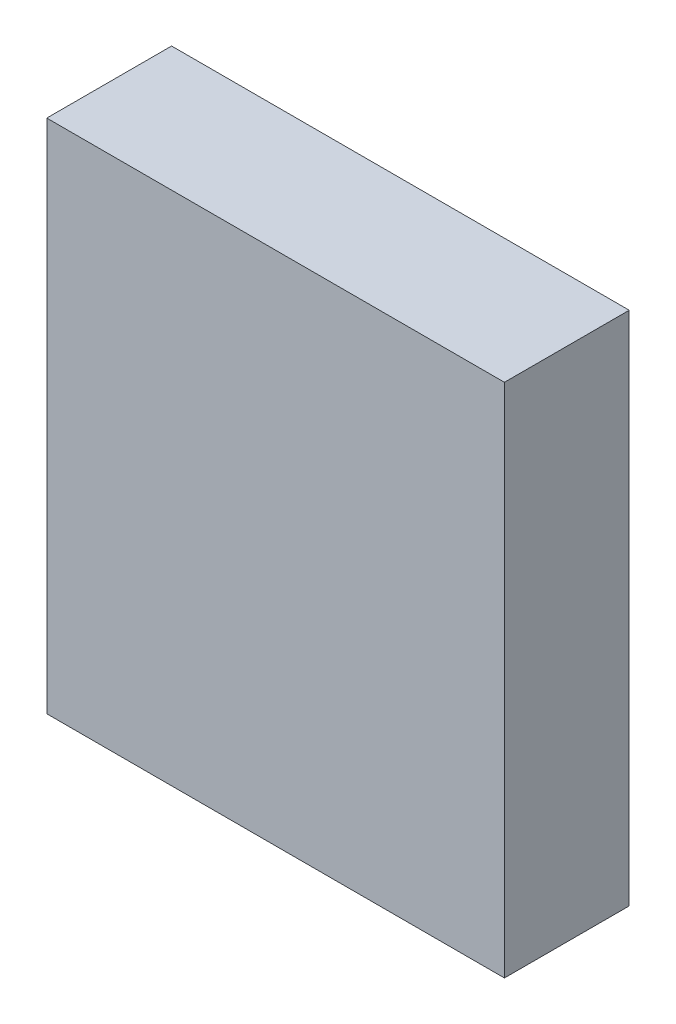
ISO-10303-21;
HEADER;
FILE_DESCRIPTION(('STEP AP214'),'2;1');
FILE_NAME('part.step','',(''),(''),'','','');
FILE_SCHEMA(('AUTOMOTIVE_DESIGN { 1 0 10303 214 1 1 1 1 }'));
ENDSEC;
DATA;
#1=APPLICATION_CONTEXT('core data for automotive mechanical design processes');
#2=APPLICATION_PROTOCOL_DEFINITION('international standard','automotive_design',2000,#1);
#3=PRODUCT_CONTEXT('',#1,'mechanical');
#4=PRODUCT('Part','Part','',(#3));
#5=PRODUCT_RELATED_PRODUCT_CATEGORY('part','',(#4));
#6=PRODUCT_DEFINITION_FORMATION('','',#4);
#7=PRODUCT_DEFINITION_CONTEXT('part definition',#1,'design');
#8=PRODUCT_DEFINITION('design','',#6,#7);
#9=PRODUCT_DEFINITION_SHAPE('','',#8);
#10=(LENGTH_UNIT() NAMED_UNIT(*) SI_UNIT(.MILLI.,.METRE.));
#11=(NAMED_UNIT(*) PLANE_ANGLE_UNIT() SI_UNIT($,.RADIAN.));
#12=(NAMED_UNIT(*) SI_UNIT($,.STERADIAN.) SOLID_ANGLE_UNIT());
#13=UNCERTAINTY_MEASURE_WITH_UNIT(LENGTH_MEASURE(1.E-05),#10,'distance_accuracy_value','');
#14=(GEOMETRIC_REPRESENTATION_CONTEXT(3) GLOBAL_UNCERTAINTY_ASSIGNED_CONTEXT((#13)) GLOBAL_UNIT_ASSIGNED_CONTEXT((#10,
#11,#12)) REPRESENTATION_CONTEXT('',''));
#15=CARTESIAN_POINT('',(0.,0.,0.));
#16=DIRECTION('',(0.,0.,1.));
#17=DIRECTION('',(1.,0.,0.));
#18=AXIS2_PLACEMENT_3D('',#15,#16,#17);
#19=CARTESIAN_POINT('',(-21.1299435028249,9.4774011299435,15.));
#20=DIRECTION('',(1.,0.,0.));
#21=DIRECTION('',(0.,1.,0.));
#22=AXIS2_PLACEMENT_3D('',#19,#20,#21);
#23=PLANE('',#22);
#24=DIRECTION('',(0.,-1.,0.));
#25=VECTOR('',#24,1.);
#26=CARTESIAN_POINT('',(-21.1299435028249,9.4774011299435,0.));
#27=LINE('',#26,#25);
#28=CARTESIAN_POINT('',(-21.1299435028249,9.4774011299435,0.));
#29=VERTEX_POINT('',#28);
#30=CARTESIAN_POINT('',(-21.1299435028249,-52.5225988700565,0.));
#31=VERTEX_POINT('',#30);
#32=EDGE_CURVE('E96',#29,#31,#27,.T.);
#33=ORIENTED_EDGE('',*,*,#32,.T.);
#34=DIRECTION('',(0.,0.,-1.));
#35=VECTOR('',#34,1.);
#36=CARTESIAN_POINT('',(-21.1299435028249,-52.5225988700565,15.));
#37=LINE('',#36,#35);
#38=CARTESIAN_POINT('',(-21.1299435028249,-52.5225988700565,15.));
#39=VERTEX_POINT('',#38);
#40=EDGE_CURVE('E11',#39,#31,#37,.T.);
#41=ORIENTED_EDGE('',*,*,#40,.F.);
#42=DIRECTION('',(0.,-1.,0.));
#43=VECTOR('',#42,1.);
#44=CARTESIAN_POINT('',(-21.1299435028249,9.4774011299435,15.));
#45=LINE('',#44,#43);
#46=CARTESIAN_POINT('',(-21.1299435028249,9.4774011299435,15.));
#47=VERTEX_POINT('',#46);
#48=EDGE_CURVE('E84',#47,#39,#45,.T.);
#49=ORIENTED_EDGE('',*,*,#48,.F.);
#50=DIRECTION('',(0.,0.,-1.));
#51=VECTOR('',#50,1.);
#52=CARTESIAN_POINT('',(-21.1299435028249,9.4774011299435,15.));
#53=LINE('',#52,#51);
#54=EDGE_CURVE('E92',#47,#29,#53,.T.);
#55=ORIENTED_EDGE('',*,*,#54,.T.);
#56=EDGE_LOOP('',(#33,#41,#49,#55));
#57=FACE_BOUND('',#56,.T.);
#58=ADVANCED_FACE('F33',(#57),#23,.F.);
#59=CARTESIAN_POINT('',(-21.1299435028249,-52.5225988700565,15.));
#60=DIRECTION('',(0.,1.,0.));
#61=DIRECTION('',(0.,0.,1.));
#62=AXIS2_PLACEMENT_3D('',#59,#60,#61);
#63=PLANE('',#62);
#64=DIRECTION('',(1.,0.,0.));
#65=VECTOR('',#64,1.);
#66=CARTESIAN_POINT('',(-21.1299435028249,-52.5225988700565,0.));
#67=LINE('',#66,#65);
#68=CARTESIAN_POINT('',(33.8700564971752,-52.5225988700565,0.));
#69=VERTEX_POINT('',#68);
#70=EDGE_CURVE('E88',#31,#69,#67,.T.);
#71=ORIENTED_EDGE('',*,*,#70,.T.);
#72=DIRECTION('',(0.,0.,-1.));
#73=VECTOR('',#72,1.);
#74=CARTESIAN_POINT('',(33.8700564971752,-52.5225988700565,15.));
#75=LINE('',#74,#73);
#76=CARTESIAN_POINT('',(33.8700564971752,-52.5225988700565,15.));
#77=VERTEX_POINT('',#76);
#78=EDGE_CURVE('E41',#77,#69,#75,.T.);
#79=ORIENTED_EDGE('',*,*,#78,.F.);
#80=DIRECTION('',(1.,0.,0.));
#81=VECTOR('',#80,1.);
#82=CARTESIAN_POINT('',(-21.1299435028249,-52.5225988700565,15.));
#83=LINE('',#82,#81);
#84=EDGE_CURVE('E79',#39,#77,#83,.T.);
#85=ORIENTED_EDGE('',*,*,#84,.F.);
#86=ORIENTED_EDGE('',*,*,#40,.T.);
#87=EDGE_LOOP('',(#71,#79,#85,#86));
#88=FACE_BOUND('',#87,.T.);
#89=ADVANCED_FACE('F87',(#88),#63,.F.);
#90=CARTESIAN_POINT('',(33.8700564971751,9.4774011299435,15.));
#91=DIRECTION('',(-1.,0.,0.));
#92=DIRECTION('',(0.,-1.,0.));
#93=AXIS2_PLACEMENT_3D('',#90,#91,#92);
#94=PLANE('',#93);
#95=DIRECTION('',(0.,1.,0.));
#96=VECTOR('',#95,1.);
#97=CARTESIAN_POINT('',(33.8700564971751,9.4774011299435,0.));
#98=LINE('',#97,#96);
#99=CARTESIAN_POINT('',(33.8700564971751,9.4774011299435,0.));
#100=VERTEX_POINT('',#99);
#101=EDGE_CURVE('E66',#69,#100,#98,.T.);
#102=ORIENTED_EDGE('',*,*,#101,.T.);
#103=DIRECTION('',(0.,0.,-1.));
#104=VECTOR('',#103,1.);
#105=CARTESIAN_POINT('',(33.8700564971751,9.4774011299435,15.));
#106=LINE('',#105,#104);
#107=CARTESIAN_POINT('',(33.8700564971751,9.4774011299435,15.));
#108=VERTEX_POINT('',#107);
#109=EDGE_CURVE('E89',#108,#100,#106,.T.);
#110=ORIENTED_EDGE('',*,*,#109,.F.);
#111=DIRECTION('',(0.,1.,0.));
#112=VECTOR('',#111,1.);
#113=CARTESIAN_POINT('',(33.8700564971751,9.4774011299435,15.));
#114=LINE('',#113,#112);
#115=EDGE_CURVE('E82',#77,#108,#114,.T.);
#116=ORIENTED_EDGE('',*,*,#115,.F.);
#117=ORIENTED_EDGE('',*,*,#78,.T.);
#118=EDGE_LOOP('',(#102,#110,#116,#117));
#119=FACE_BOUND('',#118,.T.);
#120=ADVANCED_FACE('F90',(#119),#94,.F.);
#121=CARTESIAN_POINT('',(-21.1299435028249,9.4774011299435,15.));
#122=DIRECTION('',(0.,-1.,0.));
#123=DIRECTION('',(0.,0.,-1.));
#124=AXIS2_PLACEMENT_3D('',#121,#122,#123);
#125=PLANE('',#124);
#126=DIRECTION('',(-1.,0.,0.));
#127=VECTOR('',#126,1.);
#128=CARTESIAN_POINT('',(-21.1299435028249,9.4774011299435,0.));
#129=LINE('',#128,#127);
#130=EDGE_CURVE('E72',#100,#29,#129,.T.);
#131=ORIENTED_EDGE('',*,*,#130,.T.);
#132=ORIENTED_EDGE('',*,*,#54,.F.);
#133=DIRECTION('',(-1.,0.,0.));
#134=VECTOR('',#133,1.);
#135=CARTESIAN_POINT('',(-21.1299435028249,9.4774011299435,15.));
#136=LINE('',#135,#134);
#137=EDGE_CURVE('E49',#108,#47,#136,.T.);
#138=ORIENTED_EDGE('',*,*,#137,.F.);
#139=ORIENTED_EDGE('',*,*,#109,.T.);
#140=EDGE_LOOP('',(#131,#132,#138,#139));
#141=FACE_BOUND('',#140,.T.);
#142=ADVANCED_FACE('F103',(#141),#125,.F.);
#143=CARTESIAN_POINT('',(0.,0.,15.));
#144=DIRECTION('',(0.,0.,1.));
#145=DIRECTION('',(1.,0.,0.));
#146=AXIS2_PLACEMENT_3D('',#143,#144,#145);
#147=PLANE('',#146);
#148=ORIENTED_EDGE('',*,*,#48,.T.);
#149=ORIENTED_EDGE('',*,*,#84,.T.);
#150=ORIENTED_EDGE('',*,*,#115,.T.);
#151=ORIENTED_EDGE('',*,*,#137,.T.);
#152=EDGE_LOOP('',(#148,#149,#150,#151));
#153=FACE_BOUND('',#152,.T.);
#154=ADVANCED_FACE('F80',(#153),#147,.T.);
#155=CARTESIAN_POINT('',(0.,0.,0.));
#156=DIRECTION('',(0.,0.,1.));
#157=DIRECTION('',(1.,0.,0.));
#158=AXIS2_PLACEMENT_3D('',#155,#156,#157);
#159=PLANE('',#158);
#160=ORIENTED_EDGE('',*,*,#32,.F.);
#161=ORIENTED_EDGE('',*,*,#130,.F.);
#162=ORIENTED_EDGE('',*,*,#101,.F.);
#163=ORIENTED_EDGE('',*,*,#70,.F.);
#164=EDGE_LOOP('',(#160,#161,#162,#163));
#165=FACE_BOUND('',#164,.T.);
#166=ADVANCED_FACE('F106',(#165),#159,.F.);
#167=CLOSED_SHELL('',(#58,#89,#120,#142,#154,#166));
#168=MANIFOLD_SOLID_BREP('B2',#167);
#169=ADVANCED_BREP_SHAPE_REPRESENTATION('',(#18,#168),#14);
#170=SHAPE_DEFINITION_REPRESENTATION(#9,#169);
ENDSEC;
END-ISO-10303-21;
